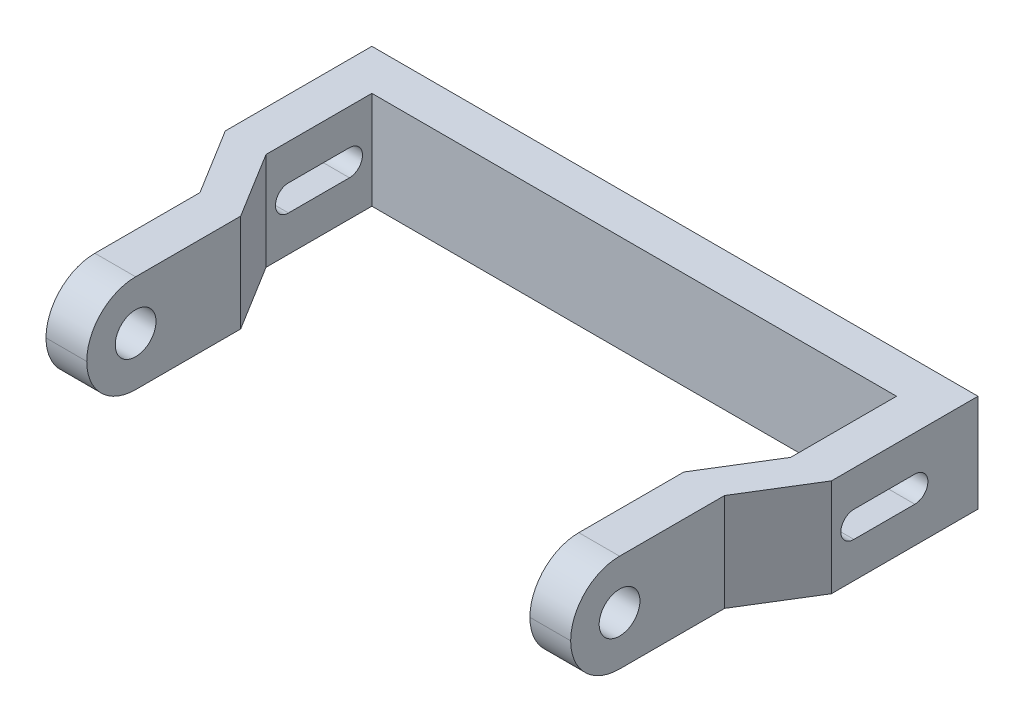
ISO-10303-21;
HEADER;
FILE_DESCRIPTION(('STEP AP214'),'2;1');
FILE_NAME('part.step','',(''),(''),'','','');
FILE_SCHEMA(('AUTOMOTIVE_DESIGN { 1 0 10303 214 1 1 1 1 }'));
ENDSEC;
DATA;
#1=APPLICATION_CONTEXT('core data for automotive mechanical design processes');
#2=APPLICATION_PROTOCOL_DEFINITION('international standard','automotive_design',2000,#1);
#3=PRODUCT_CONTEXT('',#1,'mechanical');
#4=PRODUCT('Part','Part','',(#3));
#5=PRODUCT_RELATED_PRODUCT_CATEGORY('part','',(#4));
#6=PRODUCT_DEFINITION_FORMATION('','',#4);
#7=PRODUCT_DEFINITION_CONTEXT('part definition',#1,'design');
#8=PRODUCT_DEFINITION('design','',#6,#7);
#9=PRODUCT_DEFINITION_SHAPE('','',#8);
#10=(LENGTH_UNIT() NAMED_UNIT(*) SI_UNIT(.MILLI.,.METRE.));
#11=(NAMED_UNIT(*) PLANE_ANGLE_UNIT() SI_UNIT($,.RADIAN.));
#12=(NAMED_UNIT(*) SI_UNIT($,.STERADIAN.) SOLID_ANGLE_UNIT());
#13=UNCERTAINTY_MEASURE_WITH_UNIT(LENGTH_MEASURE(1.E-05),#10,'distance_accuracy_value','');
#14=(GEOMETRIC_REPRESENTATION_CONTEXT(3) GLOBAL_UNCERTAINTY_ASSIGNED_CONTEXT((#13)) GLOBAL_UNIT_ASSIGNED_CONTEXT((#10,
#11,#12)) REPRESENTATION_CONTEXT('',''));
#15=CARTESIAN_POINT('',(0.,0.,0.));
#16=DIRECTION('',(0.,0.,1.));
#17=DIRECTION('',(1.,0.,0.));
#18=AXIS2_PLACEMENT_3D('',#15,#16,#17);
#19=CARTESIAN_POINT('',(-32.2,12.,0.));
#20=DIRECTION('',(1.,0.,0.));
#21=DIRECTION('',(0.,0.,-1.));
#22=AXIS2_PLACEMENT_3D('',#19,#20,#21);
#23=PLANE('',#22);
#24=CARTESIAN_POINT('',(-32.2,6.,-37.2476369583803));
#25=DIRECTION('',(1.,0.,0.));
#26=DIRECTION('',(0.,0.,-1.));
#27=AXIS2_PLACEMENT_3D('',#24,#25,#26);
#28=CIRCLE('',#27,1.6);
#29=CARTESIAN_POINT('',(-32.2,4.4,-37.2476369583803));
#30=VERTEX_POINT('',#29);
#31=CARTESIAN_POINT('',(-32.2,7.6,-37.2476369583803));
#32=VERTEX_POINT('',#31);
#33=EDGE_CURVE('E283',#30,#32,#28,.T.);
#34=ORIENTED_EDGE('',*,*,#33,.F.);
#35=DIRECTION('',(0.,0.,-1.));
#36=VECTOR('',#35,1.);
#37=CARTESIAN_POINT('',(-32.2,4.40000000000001,0.));
#38=LINE('',#37,#36);
#39=CARTESIAN_POINT('',(-32.2,4.4,-29.765898702015));
#40=VERTEX_POINT('',#39);
#41=EDGE_CURVE('E269',#40,#30,#38,.T.);
#42=ORIENTED_EDGE('',*,*,#41,.F.);
#43=CARTESIAN_POINT('',(-32.2,6.,-29.765898702015));
#44=DIRECTION('',(1.,0.,0.));
#45=DIRECTION('',(0.,0.,-1.));
#46=AXIS2_PLACEMENT_3D('',#43,#44,#45);
#47=CIRCLE('',#46,1.6);
#48=CARTESIAN_POINT('',(-32.2,7.6,-29.765898702015));
#49=VERTEX_POINT('',#48);
#50=EDGE_CURVE('E274',#49,#40,#47,.T.);
#51=ORIENTED_EDGE('',*,*,#50,.F.);
#52=DIRECTION('',(0.,0.,1.));
#53=VECTOR('',#52,1.);
#54=CARTESIAN_POINT('',(-32.2,7.60000000000001,0.));
#55=LINE('',#54,#53);
#56=EDGE_CURVE('E280',#32,#49,#55,.T.);
#57=ORIENTED_EDGE('',*,*,#56,.F.);
#58=EDGE_LOOP('',(#34,#42,#51,#57));
#59=FACE_BOUND('',#58,.T.);
#60=DIRECTION('',(0.,0.,1.));
#61=VECTOR('',#60,1.);
#62=CARTESIAN_POINT('',(-32.2,0.,0.));
#63=LINE('',#62,#61);
#64=CARTESIAN_POINT('',(-32.2,0.,-40.));
#65=VERTEX_POINT('',#64);
#66=CARTESIAN_POINT('',(-32.2,0.,-27.0067678301976));
#67=VERTEX_POINT('',#66);
#68=EDGE_CURVE('E295',#65,#67,#63,.T.);
#69=ORIENTED_EDGE('',*,*,#68,.F.);
#70=DIRECTION('',(0.,-1.,0.));
#71=VECTOR('',#70,1.);
#72=CARTESIAN_POINT('',(-32.2,12.,-40.));
#73=LINE('',#72,#71);
#74=CARTESIAN_POINT('',(-32.2,12.,-40.));
#75=VERTEX_POINT('',#74);
#76=EDGE_CURVE('E395',#75,#65,#73,.T.);
#77=ORIENTED_EDGE('',*,*,#76,.F.);
#78=DIRECTION('',(0.,0.,1.));
#79=VECTOR('',#78,1.);
#80=CARTESIAN_POINT('',(-32.2,12.,0.));
#81=LINE('',#80,#79);
#82=CARTESIAN_POINT('',(-32.2,12.,-27.0067678301976));
#83=VERTEX_POINT('',#82);
#84=EDGE_CURVE('E296',#75,#83,#81,.T.);
#85=ORIENTED_EDGE('',*,*,#84,.T.);
#86=DIRECTION('',(0.,-1.,0.));
#87=VECTOR('',#86,1.);
#88=CARTESIAN_POINT('',(-32.2,12.,-27.0067678301976));
#89=LINE('',#88,#87);
#90=EDGE_CURVE('E334',#83,#67,#89,.T.);
#91=ORIENTED_EDGE('',*,*,#90,.T.);
#92=EDGE_LOOP('',(#69,#77,#85,#91));
#93=FACE_BOUND('',#92,.T.);
#94=ADVANCED_FACE('F41',(#59,#93),#23,.T.);
#95=CARTESIAN_POINT('',(0.,12.,-40.));
#96=DIRECTION('',(0.,0.,1.));
#97=DIRECTION('',(1.,0.,0.));
#98=AXIS2_PLACEMENT_3D('',#95,#96,#97);
#99=PLANE('',#98);
#100=DIRECTION('',(-1.,0.,0.));
#101=VECTOR('',#100,1.);
#102=CARTESIAN_POINT('',(0.,0.,-40.));
#103=LINE('',#102,#101);
#104=CARTESIAN_POINT('',(32.2,0.,-40.));
#105=VERTEX_POINT('',#104);
#106=EDGE_CURVE('E337',#105,#65,#103,.T.);
#107=ORIENTED_EDGE('',*,*,#106,.F.);
#108=DIRECTION('',(0.,-1.,0.));
#109=VECTOR('',#108,1.);
#110=CARTESIAN_POINT('',(32.2,12.,-40.));
#111=LINE('',#110,#109);
#112=CARTESIAN_POINT('',(32.2,12.,-40.));
#113=VERTEX_POINT('',#112);
#114=EDGE_CURVE('E393',#113,#105,#111,.T.);
#115=ORIENTED_EDGE('',*,*,#114,.F.);
#116=DIRECTION('',(-1.,0.,0.));
#117=VECTOR('',#116,1.);
#118=CARTESIAN_POINT('',(0.,12.,-40.));
#119=LINE('',#118,#117);
#120=EDGE_CURVE('E299',#113,#75,#119,.T.);
#121=ORIENTED_EDGE('',*,*,#120,.T.);
#122=ORIENTED_EDGE('',*,*,#76,.T.);
#123=EDGE_LOOP('',(#107,#115,#121,#122));
#124=FACE_BOUND('',#123,.T.);
#125=ADVANCED_FACE('F491',(#124),#99,.T.);
#126=CARTESIAN_POINT('',(32.2,12.,0.));
#127=DIRECTION('',(1.,0.,0.));
#128=DIRECTION('',(0.,0.,-1.));
#129=AXIS2_PLACEMENT_3D('',#126,#127,#128);
#130=PLANE('',#129);
#131=DIRECTION('',(0.,0.,-1.));
#132=VECTOR('',#131,1.);
#133=CARTESIAN_POINT('',(32.2,4.40000000000001,0.));
#134=LINE('',#133,#132);
#135=CARTESIAN_POINT('',(32.2,4.4,-29.765898702015));
#136=VERTEX_POINT('',#135);
#137=CARTESIAN_POINT('',(32.2,4.4,-37.2476369583803));
#138=VERTEX_POINT('',#137);
#139=EDGE_CURVE('E261',#136,#138,#134,.T.);
#140=ORIENTED_EDGE('',*,*,#139,.T.);
#141=CARTESIAN_POINT('',(32.2,6.,-37.2476369583803));
#142=DIRECTION('',(1.,0.,0.));
#143=DIRECTION('',(0.,0.,-1.));
#144=AXIS2_PLACEMENT_3D('',#141,#142,#143);
#145=CIRCLE('',#144,1.6);
#146=CARTESIAN_POINT('',(32.2,7.6,-37.2476369583803));
#147=VERTEX_POINT('',#146);
#148=EDGE_CURVE('E223',#138,#147,#145,.T.);
#149=ORIENTED_EDGE('',*,*,#148,.T.);
#150=DIRECTION('',(0.,0.,1.));
#151=VECTOR('',#150,1.);
#152=CARTESIAN_POINT('',(32.2,7.60000000000001,0.));
#153=LINE('',#152,#151);
#154=CARTESIAN_POINT('',(32.2,7.6,-29.765898702015));
#155=VERTEX_POINT('',#154);
#156=EDGE_CURVE('E277',#147,#155,#153,.T.);
#157=ORIENTED_EDGE('',*,*,#156,.T.);
#158=CARTESIAN_POINT('',(32.2,6.,-29.765898702015));
#159=DIRECTION('',(1.,0.,0.));
#160=DIRECTION('',(0.,0.,-1.));
#161=AXIS2_PLACEMENT_3D('',#158,#159,#160);
#162=CIRCLE('',#161,1.6);
#163=EDGE_CURVE('E271',#155,#136,#162,.T.);
#164=ORIENTED_EDGE('',*,*,#163,.T.);
#165=EDGE_LOOP('',(#140,#149,#157,#164));
#166=FACE_BOUND('',#165,.T.);
#167=DIRECTION('',(0.,0.,1.));
#168=VECTOR('',#167,1.);
#169=CARTESIAN_POINT('',(32.2,0.,0.));
#170=LINE('',#169,#168);
#171=CARTESIAN_POINT('',(32.2,0.,-27.0067678301976));
#172=VERTEX_POINT('',#171);
#173=EDGE_CURVE('E340',#105,#172,#170,.T.);
#174=ORIENTED_EDGE('',*,*,#173,.T.);
#175=DIRECTION('',(0.,-1.,0.));
#176=VECTOR('',#175,1.);
#177=CARTESIAN_POINT('',(32.2,12.,-27.0067678301976));
#178=LINE('',#177,#176);
#179=CARTESIAN_POINT('',(32.2,12.,-27.0067678301976));
#180=VERTEX_POINT('',#179);
#181=EDGE_CURVE('E390',#180,#172,#178,.T.);
#182=ORIENTED_EDGE('',*,*,#181,.F.);
#183=DIRECTION('',(0.,0.,1.));
#184=VECTOR('',#183,1.);
#185=CARTESIAN_POINT('',(32.2,12.,0.));
#186=LINE('',#185,#184);
#187=EDGE_CURVE('E303',#113,#180,#186,.T.);
#188=ORIENTED_EDGE('',*,*,#187,.F.);
#189=ORIENTED_EDGE('',*,*,#114,.T.);
#190=EDGE_LOOP('',(#174,#182,#188,#189));
#191=FACE_BOUND('',#190,.T.);
#192=ADVANCED_FACE('F494',(#166,#191),#130,.F.);
#193=CARTESIAN_POINT('',(11.2701558565888,12.,6.94714132776244));
#194=DIRECTION('',(0.851264943092478,0.,0.524736120980593));
#195=DIRECTION('',(0.524736120980593,0.,-0.851264943092478));
#196=AXIS2_PLACEMENT_3D('',#193,#194,#195);
#197=PLANE('',#196);
#198=DIRECTION('',(-0.524736120980593,0.,0.851264943092478));
#199=VECTOR('',#198,1.);
#200=CARTESIAN_POINT('',(11.2701558565888,0.,6.94714132776244));
#201=LINE('',#200,#199);
#202=CARTESIAN_POINT('',(27.2,0.,-18.8954056706641));
#203=VERTEX_POINT('',#202);
#204=EDGE_CURVE('E342',#172,#203,#201,.T.);
#205=ORIENTED_EDGE('',*,*,#204,.T.);
#206=DIRECTION('',(0.,-1.,0.));
#207=VECTOR('',#206,1.);
#208=CARTESIAN_POINT('',(27.2,12.,-18.8954056706641));
#209=LINE('',#208,#207);
#210=CARTESIAN_POINT('',(27.2,12.,-18.8954056706641));
#211=VERTEX_POINT('',#210);
#212=EDGE_CURVE('E387',#211,#203,#209,.T.);
#213=ORIENTED_EDGE('',*,*,#212,.F.);
#214=DIRECTION('',(-0.524736120980593,0.,0.851264943092478));
#215=VECTOR('',#214,1.);
#216=CARTESIAN_POINT('',(11.2701558565888,12.,6.94714132776244));
#217=LINE('',#216,#215);
#218=EDGE_CURVE('E305',#180,#211,#217,.T.);
#219=ORIENTED_EDGE('',*,*,#218,.F.);
#220=ORIENTED_EDGE('',*,*,#181,.T.);
#221=EDGE_LOOP('',(#205,#213,#219,#220));
#222=FACE_BOUND('',#221,.T.);
#223=ADVANCED_FACE('F442',(#222),#197,.F.);
#224=CARTESIAN_POINT('',(27.2,12.,0.));
#225=DIRECTION('',(1.,0.,0.));
#226=DIRECTION('',(0.,0.,-1.));
#227=AXIS2_PLACEMENT_3D('',#224,#225,#226);
#228=PLANE('',#227);
#229=CARTESIAN_POINT('',(27.2,6.,-5.99999999999998));
#230=DIRECTION('',(1.,0.,0.));
#231=DIRECTION('',(0.,0.,-1.));
#232=AXIS2_PLACEMENT_3D('',#229,#230,#231);
#233=CIRCLE('',#232,2.5);
#234=CARTESIAN_POINT('',(27.2,6.,-8.49999999999998));
#235=VERTEX_POINT('',#234);
#236=EDGE_CURVE('E292',#235,#235,#233,.T.);
#237=ORIENTED_EDGE('',*,*,#236,.T.);
#238=EDGE_LOOP('',(#237));
#239=FACE_BOUND('',#238,.T.);
#240=DIRECTION('',(0.,0.,1.));
#241=VECTOR('',#240,1.);
#242=CARTESIAN_POINT('',(27.2,0.,0.));
#243=LINE('',#242,#241);
#244=CARTESIAN_POINT('',(27.2,0.,-6.));
#245=VERTEX_POINT('',#244);
#246=EDGE_CURVE('E344',#203,#245,#243,.T.);
#247=ORIENTED_EDGE('',*,*,#246,.T.);
#248=CARTESIAN_POINT('',(27.2,6.,-6.));
#249=DIRECTION('',(1.,0.,0.));
#250=DIRECTION('',(0.,0.,-1.));
#251=AXIS2_PLACEMENT_3D('',#248,#249,#250);
#252=CIRCLE('',#251,6.);
#253=CARTESIAN_POINT('',(27.2,6.,0.));
#254=VERTEX_POINT('',#253);
#255=EDGE_CURVE('E11',#245,#254,#252,.F.);
#256=ORIENTED_EDGE('',*,*,#255,.T.);
#257=CARTESIAN_POINT('',(27.2,6.,-6.));
#258=DIRECTION('',(1.,0.,0.));
#259=DIRECTION('',(0.,0.,-1.));
#260=AXIS2_PLACEMENT_3D('',#257,#258,#259);
#261=CIRCLE('',#260,6.);
#262=CARTESIAN_POINT('',(27.2,12.,-6.));
#263=VERTEX_POINT('',#262);
#264=EDGE_CURVE('E50',#254,#263,#261,.F.);
#265=ORIENTED_EDGE('',*,*,#264,.T.);
#266=DIRECTION('',(0.,0.,1.));
#267=VECTOR('',#266,1.);
#268=CARTESIAN_POINT('',(27.2,12.,0.));
#269=LINE('',#268,#267);
#270=EDGE_CURVE('E307',#211,#263,#269,.T.);
#271=ORIENTED_EDGE('',*,*,#270,.F.);
#272=ORIENTED_EDGE('',*,*,#212,.T.);
#273=EDGE_LOOP('',(#247,#256,#265,#271,#272));
#274=FACE_BOUND('',#273,.T.);
#275=ADVANCED_FACE('F432',(#239,#274),#228,.F.);
#276=CARTESIAN_POINT('',(32.2,12.,0.));
#277=DIRECTION('',(1.,0.,0.));
#278=DIRECTION('',(0.,0.,-1.));
#279=AXIS2_PLACEMENT_3D('',#276,#277,#278);
#280=PLANE('',#279);
#281=CARTESIAN_POINT('',(32.2,6.,-5.99999999999997));
#282=DIRECTION('',(1.,0.,0.));
#283=DIRECTION('',(0.,0.,-1.));
#284=AXIS2_PLACEMENT_3D('',#281,#282,#283);
#285=CIRCLE('',#284,2.5);
#286=CARTESIAN_POINT('',(32.2,6.,-8.49999999999997));
#287=VERTEX_POINT('',#286);
#288=EDGE_CURVE('E289',#287,#287,#285,.T.);
#289=ORIENTED_EDGE('',*,*,#288,.F.);
#290=EDGE_LOOP('',(#289));
#291=FACE_BOUND('',#290,.T.);
#292=CARTESIAN_POINT('',(32.2,6.,-6.));
#293=DIRECTION('',(1.,0.,0.));
#294=DIRECTION('',(0.,0.,-1.));
#295=AXIS2_PLACEMENT_3D('',#292,#293,#294);
#296=CIRCLE('',#295,6.);
#297=CARTESIAN_POINT('',(32.2,12.,-6.));
#298=VERTEX_POINT('',#297);
#299=CARTESIAN_POINT('',(32.2,6.,0.));
#300=VERTEX_POINT('',#299);
#301=EDGE_CURVE('E64',#298,#300,#296,.T.);
#302=ORIENTED_EDGE('',*,*,#301,.T.);
#303=CARTESIAN_POINT('',(32.2,6.,-6.));
#304=DIRECTION('',(1.,0.,0.));
#305=DIRECTION('',(0.,0.,-1.));
#306=AXIS2_PLACEMENT_3D('',#303,#304,#305);
#307=CIRCLE('',#306,6.);
#308=CARTESIAN_POINT('',(32.2,0.,-6.));
#309=VERTEX_POINT('',#308);
#310=EDGE_CURVE('E418',#300,#309,#307,.T.);
#311=ORIENTED_EDGE('',*,*,#310,.T.);
#312=DIRECTION('',(0.,0.,1.));
#313=VECTOR('',#312,1.);
#314=CARTESIAN_POINT('',(32.2,0.,0.));
#315=LINE('',#314,#313);
#316=CARTESIAN_POINT('',(32.2,0.,-18.8954056706641));
#317=VERTEX_POINT('',#316);
#318=EDGE_CURVE('E346',#317,#309,#315,.T.);
#319=ORIENTED_EDGE('',*,*,#318,.F.);
#320=DIRECTION('',(0.,-1.,0.));
#321=VECTOR('',#320,1.);
#322=CARTESIAN_POINT('',(32.2,12.,-18.8954056706641));
#323=LINE('',#322,#321);
#324=CARTESIAN_POINT('',(32.2,12.,-18.8954056706641));
#325=VERTEX_POINT('',#324);
#326=EDGE_CURVE('E385',#325,#317,#323,.T.);
#327=ORIENTED_EDGE('',*,*,#326,.F.);
#328=DIRECTION('',(0.,0.,1.));
#329=VECTOR('',#328,1.);
#330=CARTESIAN_POINT('',(32.2,12.,0.));
#331=LINE('',#330,#329);
#332=EDGE_CURVE('E310',#325,#298,#331,.T.);
#333=ORIENTED_EDGE('',*,*,#332,.T.);
#334=EDGE_LOOP('',(#302,#311,#319,#327,#333));
#335=FACE_BOUND('',#334,.T.);
#336=ADVANCED_FACE('F450',(#291,#335),#280,.T.);
#337=CARTESIAN_POINT('',(14.89341587328,12.,9.180588648588));
#338=DIRECTION('',(0.851264943092478,0.,0.524736120980593));
#339=DIRECTION('',(0.524736120980593,0.,-0.851264943092478));
#340=AXIS2_PLACEMENT_3D('',#337,#338,#339);
#341=PLANE('',#340);
#342=DIRECTION('',(-0.524736120980593,0.,0.851264943092478));
#343=VECTOR('',#342,1.);
#344=CARTESIAN_POINT('',(14.89341587328,0.,9.180588648588));
#345=LINE('',#344,#343);
#346=CARTESIAN_POINT('',(37.2,0.,-27.0067678301976));
#347=VERTEX_POINT('',#346);
#348=EDGE_CURVE('E349',#347,#317,#345,.T.);
#349=ORIENTED_EDGE('',*,*,#348,.F.);
#350=DIRECTION('',(0.,-1.,0.));
#351=VECTOR('',#350,1.);
#352=CARTESIAN_POINT('',(37.2,12.,-27.0067678301976));
#353=LINE('',#352,#351);
#354=CARTESIAN_POINT('',(37.2,12.,-27.0067678301976));
#355=VERTEX_POINT('',#354);
#356=EDGE_CURVE('E383',#355,#347,#353,.T.);
#357=ORIENTED_EDGE('',*,*,#356,.F.);
#358=DIRECTION('',(-0.524736120980593,0.,0.851264943092478));
#359=VECTOR('',#358,1.);
#360=CARTESIAN_POINT('',(14.89341587328,12.,9.180588648588));
#361=LINE('',#360,#359);
#362=EDGE_CURVE('E312',#355,#325,#361,.T.);
#363=ORIENTED_EDGE('',*,*,#362,.T.);
#364=ORIENTED_EDGE('',*,*,#326,.T.);
#365=EDGE_LOOP('',(#349,#357,#363,#364));
#366=FACE_BOUND('',#365,.T.);
#367=ADVANCED_FACE('F454',(#366),#341,.T.);
#368=CARTESIAN_POINT('',(37.2,12.,0.));
#369=DIRECTION('',(1.,0.,0.));
#370=DIRECTION('',(0.,0.,-1.));
#371=AXIS2_PLACEMENT_3D('',#368,#369,#370);
#372=PLANE('',#371);
#373=CARTESIAN_POINT('',(37.2,6.,-37.2476369583803));
#374=DIRECTION('',(-1.,0.,0.));
#375=DIRECTION('',(0.,0.,1.));
#376=AXIS2_PLACEMENT_3D('',#373,#374,#375);
#377=CIRCLE('',#376,1.6);
#378=CARTESIAN_POINT('',(37.2,7.6,-37.2476369583803));
#379=VERTEX_POINT('',#378);
#380=CARTESIAN_POINT('',(37.2,4.4,-37.2476369583803));
#381=VERTEX_POINT('',#380);
#382=EDGE_CURVE('E220',#379,#381,#377,.T.);
#383=ORIENTED_EDGE('',*,*,#382,.T.);
#384=DIRECTION('',(0.,0.,1.));
#385=VECTOR('',#384,1.);
#386=CARTESIAN_POINT('',(37.2,4.4,-37.2476369583803));
#387=LINE('',#386,#385);
#388=CARTESIAN_POINT('',(37.2,4.4,-29.765898702015));
#389=VERTEX_POINT('',#388);
#390=EDGE_CURVE('E231',#381,#389,#387,.T.);
#391=ORIENTED_EDGE('',*,*,#390,.T.);
#392=CARTESIAN_POINT('',(37.2,6.,-29.765898702015));
#393=DIRECTION('',(-1.,0.,0.));
#394=DIRECTION('',(0.,0.,1.));
#395=AXIS2_PLACEMENT_3D('',#392,#393,#394);
#396=CIRCLE('',#395,1.6);
#397=CARTESIAN_POINT('',(37.2,7.6,-29.765898702015));
#398=VERTEX_POINT('',#397);
#399=EDGE_CURVE('E237',#389,#398,#396,.T.);
#400=ORIENTED_EDGE('',*,*,#399,.T.);
#401=DIRECTION('',(0.,0.,-1.));
#402=VECTOR('',#401,1.);
#403=CARTESIAN_POINT('',(37.2,7.6,-37.2476369583803));
#404=LINE('',#403,#402);
#405=EDGE_CURVE('E242',#398,#379,#404,.T.);
#406=ORIENTED_EDGE('',*,*,#405,.T.);
#407=EDGE_LOOP('',(#383,#391,#400,#406));
#408=FACE_BOUND('',#407,.T.);
#409=DIRECTION('',(0.,0.,1.));
#410=VECTOR('',#409,1.);
#411=CARTESIAN_POINT('',(37.2,0.,0.));
#412=LINE('',#411,#410);
#413=CARTESIAN_POINT('',(37.2,0.,-45.));
#414=VERTEX_POINT('',#413);
#415=EDGE_CURVE('E352',#414,#347,#412,.T.);
#416=ORIENTED_EDGE('',*,*,#415,.F.);
#417=DIRECTION('',(0.,-1.,0.));
#418=VECTOR('',#417,1.);
#419=CARTESIAN_POINT('',(37.2,12.,-45.));
#420=LINE('',#419,#418);
#421=CARTESIAN_POINT('',(37.2,12.,-45.));
#422=VERTEX_POINT('',#421);
#423=EDGE_CURVE('E381',#422,#414,#420,.T.);
#424=ORIENTED_EDGE('',*,*,#423,.F.);
#425=DIRECTION('',(0.,0.,1.));
#426=VECTOR('',#425,1.);
#427=CARTESIAN_POINT('',(37.2,12.,0.));
#428=LINE('',#427,#426);
#429=EDGE_CURVE('E315',#422,#355,#428,.T.);
#430=ORIENTED_EDGE('',*,*,#429,.T.);
#431=ORIENTED_EDGE('',*,*,#356,.T.);
#432=EDGE_LOOP('',(#416,#424,#430,#431));
#433=FACE_BOUND('',#432,.T.);
#434=ADVANCED_FACE('F239',(#408,#433),#372,.T.);
#435=CARTESIAN_POINT('',(0.,12.,-45.));
#436=DIRECTION('',(0.,0.,-1.));
#437=DIRECTION('',(-1.,0.,0.));
#438=AXIS2_PLACEMENT_3D('',#435,#436,#437);
#439=PLANE('',#438);
#440=DIRECTION('',(1.,0.,0.));
#441=VECTOR('',#440,1.);
#442=CARTESIAN_POINT('',(0.,0.,-45.));
#443=LINE('',#442,#441);
#444=CARTESIAN_POINT('',(-37.2,0.,-45.));
#445=VERTEX_POINT('',#444);
#446=EDGE_CURVE('E355',#445,#414,#443,.T.);
#447=ORIENTED_EDGE('',*,*,#446,.F.);
#448=DIRECTION('',(0.,-1.,0.));
#449=VECTOR('',#448,1.);
#450=CARTESIAN_POINT('',(-37.2,12.,-45.));
#451=LINE('',#450,#449);
#452=CARTESIAN_POINT('',(-37.2,12.,-45.));
#453=VERTEX_POINT('',#452);
#454=EDGE_CURVE('E379',#453,#445,#451,.T.);
#455=ORIENTED_EDGE('',*,*,#454,.F.);
#456=DIRECTION('',(1.,0.,0.));
#457=VECTOR('',#456,1.);
#458=CARTESIAN_POINT('',(0.,12.,-45.));
#459=LINE('',#458,#457);
#460=EDGE_CURVE('E318',#453,#422,#459,.T.);
#461=ORIENTED_EDGE('',*,*,#460,.T.);
#462=ORIENTED_EDGE('',*,*,#423,.T.);
#463=EDGE_LOOP('',(#447,#455,#461,#462));
#464=FACE_BOUND('',#463,.T.);
#465=ADVANCED_FACE('F459',(#464),#439,.T.);
#466=CARTESIAN_POINT('',(-37.2,12.,0.));
#467=DIRECTION('',(1.,0.,0.));
#468=DIRECTION('',(0.,0.,-1.));
#469=AXIS2_PLACEMENT_3D('',#466,#467,#468);
#470=PLANE('',#469);
#471=DIRECTION('',(0.,0.,1.));
#472=VECTOR('',#471,1.);
#473=CARTESIAN_POINT('',(-37.2,4.4,-37.2476369583803));
#474=LINE('',#473,#472);
#475=CARTESIAN_POINT('',(-37.2,4.4,-37.2476369583803));
#476=VERTEX_POINT('',#475);
#477=CARTESIAN_POINT('',(-37.2,4.4,-29.765898702015));
#478=VERTEX_POINT('',#477);
#479=EDGE_CURVE('E253',#476,#478,#474,.T.);
#480=ORIENTED_EDGE('',*,*,#479,.F.);
#481=CARTESIAN_POINT('',(-37.2,6.,-37.2476369583803));
#482=DIRECTION('',(-1.,0.,0.));
#483=DIRECTION('',(0.,0.,1.));
#484=AXIS2_PLACEMENT_3D('',#481,#482,#483);
#485=CIRCLE('',#484,1.6);
#486=CARTESIAN_POINT('',(-37.2,7.6,-37.2476369583803));
#487=VERTEX_POINT('',#486);
#488=EDGE_CURVE('E251',#487,#476,#485,.T.);
#489=ORIENTED_EDGE('',*,*,#488,.F.);
#490=DIRECTION('',(0.,0.,-1.));
#491=VECTOR('',#490,1.);
#492=CARTESIAN_POINT('',(-37.2,7.6,-37.2476369583803));
#493=LINE('',#492,#491);
#494=CARTESIAN_POINT('',(-37.2,7.6,-29.765898702015));
#495=VERTEX_POINT('',#494);
#496=EDGE_CURVE('E243',#495,#487,#493,.T.);
#497=ORIENTED_EDGE('',*,*,#496,.F.);
#498=CARTESIAN_POINT('',(-37.2,6.,-29.765898702015));
#499=DIRECTION('',(-1.,0.,0.));
#500=DIRECTION('',(0.,0.,1.));
#501=AXIS2_PLACEMENT_3D('',#498,#499,#500);
#502=CIRCLE('',#501,1.6);
#503=EDGE_CURVE('E246',#478,#495,#502,.T.);
#504=ORIENTED_EDGE('',*,*,#503,.F.);
#505=EDGE_LOOP('',(#480,#489,#497,#504));
#506=FACE_BOUND('',#505,.T.);
#507=DIRECTION('',(0.,0.,1.));
#508=VECTOR('',#507,1.);
#509=CARTESIAN_POINT('',(-37.2,0.,0.));
#510=LINE('',#509,#508);
#511=CARTESIAN_POINT('',(-37.2,0.,-27.0067678301976));
#512=VERTEX_POINT('',#511);
#513=EDGE_CURVE('E358',#445,#512,#510,.T.);
#514=ORIENTED_EDGE('',*,*,#513,.T.);
#515=DIRECTION('',(0.,-1.,0.));
#516=VECTOR('',#515,1.);
#517=CARTESIAN_POINT('',(-37.2,12.,-27.0067678301976));
#518=LINE('',#517,#516);
#519=CARTESIAN_POINT('',(-37.2,12.,-27.0067678301976));
#520=VERTEX_POINT('',#519);
#521=EDGE_CURVE('E376',#520,#512,#518,.T.);
#522=ORIENTED_EDGE('',*,*,#521,.F.);
#523=DIRECTION('',(0.,0.,1.));
#524=VECTOR('',#523,1.);
#525=CARTESIAN_POINT('',(-37.2,12.,0.));
#526=LINE('',#525,#524);
#527=EDGE_CURVE('E321',#453,#520,#526,.T.);
#528=ORIENTED_EDGE('',*,*,#527,.F.);
#529=ORIENTED_EDGE('',*,*,#454,.T.);
#530=EDGE_LOOP('',(#514,#522,#528,#529));
#531=FACE_BOUND('',#530,.T.);
#532=ADVANCED_FACE('F464',(#506,#531),#470,.F.);
#533=CARTESIAN_POINT('',(-14.89341587328,12.,9.180588648588));
#534=DIRECTION('',(0.851264943092478,0.,-0.524736120980593));
#535=DIRECTION('',(-0.524736120980593,0.,-0.851264943092478));
#536=AXIS2_PLACEMENT_3D('',#533,#534,#535);
#537=PLANE('',#536);
#538=DIRECTION('',(0.524736120980593,0.,0.851264943092478));
#539=VECTOR('',#538,1.);
#540=CARTESIAN_POINT('',(-14.89341587328,0.,9.180588648588));
#541=LINE('',#540,#539);
#542=CARTESIAN_POINT('',(-32.2,0.,-18.8954056706641));
#543=VERTEX_POINT('',#542);
#544=EDGE_CURVE('E360',#512,#543,#541,.T.);
#545=ORIENTED_EDGE('',*,*,#544,.T.);
#546=DIRECTION('',(0.,-1.,0.));
#547=VECTOR('',#546,1.);
#548=CARTESIAN_POINT('',(-32.2,12.,-18.8954056706641));
#549=LINE('',#548,#547);
#550=CARTESIAN_POINT('',(-32.2,12.,-18.8954056706641));
#551=VERTEX_POINT('',#550);
#552=EDGE_CURVE('E373',#551,#543,#549,.T.);
#553=ORIENTED_EDGE('',*,*,#552,.F.);
#554=DIRECTION('',(0.524736120980593,0.,0.851264943092478));
#555=VECTOR('',#554,1.);
#556=CARTESIAN_POINT('',(-14.89341587328,12.,9.180588648588));
#557=LINE('',#556,#555);
#558=EDGE_CURVE('E323',#520,#551,#557,.T.);
#559=ORIENTED_EDGE('',*,*,#558,.F.);
#560=ORIENTED_EDGE('',*,*,#521,.T.);
#561=EDGE_LOOP('',(#545,#553,#559,#560));
#562=FACE_BOUND('',#561,.T.);
#563=ADVANCED_FACE('F470',(#562),#537,.F.);
#564=CARTESIAN_POINT('',(-32.2,12.,0.));
#565=DIRECTION('',(1.,0.,0.));
#566=DIRECTION('',(0.,0.,-1.));
#567=AXIS2_PLACEMENT_3D('',#564,#565,#566);
#568=PLANE('',#567);
#569=CARTESIAN_POINT('',(-32.2,6.,-6.00000000000003));
#570=DIRECTION('',(-1.,0.,0.));
#571=DIRECTION('',(0.,0.,1.));
#572=AXIS2_PLACEMENT_3D('',#569,#570,#571);
#573=CIRCLE('',#572,2.5);
#574=CARTESIAN_POINT('',(-32.2,6.,-3.50000000000003));
#575=VERTEX_POINT('',#574);
#576=EDGE_CURVE('E285',#575,#575,#573,.T.);
#577=ORIENTED_EDGE('',*,*,#576,.F.);
#578=EDGE_LOOP('',(#577));
#579=FACE_BOUND('',#578,.T.);
#580=DIRECTION('',(0.,0.,1.));
#581=VECTOR('',#580,1.);
#582=CARTESIAN_POINT('',(-32.2,0.,0.));
#583=LINE('',#582,#581);
#584=CARTESIAN_POINT('',(-32.2,0.,-6.));
#585=VERTEX_POINT('',#584);
#586=EDGE_CURVE('E362',#543,#585,#583,.T.);
#587=ORIENTED_EDGE('',*,*,#586,.T.);
#588=CARTESIAN_POINT('',(-32.2,6.,-6.));
#589=DIRECTION('',(1.,0.,0.));
#590=DIRECTION('',(0.,0.,-1.));
#591=AXIS2_PLACEMENT_3D('',#588,#589,#590);
#592=CIRCLE('',#591,6.);
#593=CARTESIAN_POINT('',(-32.2,6.,0.));
#594=VERTEX_POINT('',#593);
#595=EDGE_CURVE('E407',#585,#594,#592,.F.);
#596=ORIENTED_EDGE('',*,*,#595,.T.);
#597=CARTESIAN_POINT('',(-32.2,6.,-6.));
#598=DIRECTION('',(1.,0.,0.));
#599=DIRECTION('',(0.,0.,-1.));
#600=AXIS2_PLACEMENT_3D('',#597,#598,#599);
#601=CIRCLE('',#600,6.);
#602=CARTESIAN_POINT('',(-32.2,12.,-6.));
#603=VERTEX_POINT('',#602);
#604=EDGE_CURVE('E405',#594,#603,#601,.F.);
#605=ORIENTED_EDGE('',*,*,#604,.T.);
#606=DIRECTION('',(0.,0.,1.));
#607=VECTOR('',#606,1.);
#608=CARTESIAN_POINT('',(-32.2,12.,0.));
#609=LINE('',#608,#607);
#610=EDGE_CURVE('E325',#551,#603,#609,.T.);
#611=ORIENTED_EDGE('',*,*,#610,.F.);
#612=ORIENTED_EDGE('',*,*,#552,.T.);
#613=EDGE_LOOP('',(#587,#596,#605,#611,#612));
#614=FACE_BOUND('',#613,.T.);
#615=ADVANCED_FACE('F474',(#579,#614),#568,.F.);
#616=CARTESIAN_POINT('',(-27.2,12.,0.));
#617=DIRECTION('',(1.,0.,0.));
#618=DIRECTION('',(0.,0.,-1.));
#619=AXIS2_PLACEMENT_3D('',#616,#617,#618);
#620=PLANE('',#619);
#621=CARTESIAN_POINT('',(-27.2,6.,-6.00000000000002));
#622=DIRECTION('',(1.,0.,0.));
#623=DIRECTION('',(0.,0.,-1.));
#624=AXIS2_PLACEMENT_3D('',#621,#622,#623);
#625=CIRCLE('',#624,2.5);
#626=CARTESIAN_POINT('',(-27.2,6.,-8.50000000000002));
#627=VERTEX_POINT('',#626);
#628=EDGE_CURVE('E288',#627,#627,#625,.T.);
#629=ORIENTED_EDGE('',*,*,#628,.F.);
#630=EDGE_LOOP('',(#629));
#631=FACE_BOUND('',#630,.T.);
#632=CARTESIAN_POINT('',(-27.2,6.,-6.));
#633=DIRECTION('',(1.,0.,0.));
#634=DIRECTION('',(0.,0.,-1.));
#635=AXIS2_PLACEMENT_3D('',#632,#633,#634);
#636=CIRCLE('',#635,6.);
#637=CARTESIAN_POINT('',(-27.2,12.,-6.));
#638=VERTEX_POINT('',#637);
#639=CARTESIAN_POINT('',(-27.2,6.,0.));
#640=VERTEX_POINT('',#639);
#641=EDGE_CURVE('E409',#638,#640,#636,.T.);
#642=ORIENTED_EDGE('',*,*,#641,.T.);
#643=CARTESIAN_POINT('',(-27.2,6.,-6.));
#644=DIRECTION('',(1.,0.,0.));
#645=DIRECTION('',(0.,0.,-1.));
#646=AXIS2_PLACEMENT_3D('',#643,#644,#645);
#647=CIRCLE('',#646,6.);
#648=CARTESIAN_POINT('',(-27.2,0.,-6.));
#649=VERTEX_POINT('',#648);
#650=EDGE_CURVE('E411',#640,#649,#647,.T.);
#651=ORIENTED_EDGE('',*,*,#650,.T.);
#652=DIRECTION('',(0.,0.,1.));
#653=VECTOR('',#652,1.);
#654=CARTESIAN_POINT('',(-27.2,0.,0.));
#655=LINE('',#654,#653);
#656=CARTESIAN_POINT('',(-27.2,0.,-18.8954056706641));
#657=VERTEX_POINT('',#656);
#658=EDGE_CURVE('E365',#657,#649,#655,.T.);
#659=ORIENTED_EDGE('',*,*,#658,.F.);
#660=DIRECTION('',(0.,-1.,0.));
#661=VECTOR('',#660,1.);
#662=CARTESIAN_POINT('',(-27.2,12.,-18.8954056706641));
#663=LINE('',#662,#661);
#664=CARTESIAN_POINT('',(-27.2,12.,-18.8954056706641));
#665=VERTEX_POINT('',#664);
#666=EDGE_CURVE('E371',#665,#657,#663,.T.);
#667=ORIENTED_EDGE('',*,*,#666,.F.);
#668=DIRECTION('',(0.,0.,1.));
#669=VECTOR('',#668,1.);
#670=CARTESIAN_POINT('',(-27.2,12.,0.));
#671=LINE('',#670,#669);
#672=EDGE_CURVE('E328',#665,#638,#671,.T.);
#673=ORIENTED_EDGE('',*,*,#672,.T.);
#674=EDGE_LOOP('',(#642,#651,#659,#667,#673));
#675=FACE_BOUND('',#674,.T.);
#676=ADVANCED_FACE('F482',(#631,#675),#620,.T.);
#677=CARTESIAN_POINT('',(-11.2701558565888,12.,6.94714132776244));
#678=DIRECTION('',(0.851264943092478,0.,-0.524736120980593));
#679=DIRECTION('',(-0.524736120980593,0.,-0.851264943092478));
#680=AXIS2_PLACEMENT_3D('',#677,#678,#679);
#681=PLANE('',#680);
#682=DIRECTION('',(0.524736120980593,0.,0.851264943092478));
#683=VECTOR('',#682,1.);
#684=CARTESIAN_POINT('',(-11.2701558565888,0.,6.94714132776244));
#685=LINE('',#684,#683);
#686=EDGE_CURVE('E300',#67,#657,#685,.T.);
#687=ORIENTED_EDGE('',*,*,#686,.F.);
#688=ORIENTED_EDGE('',*,*,#90,.F.);
#689=DIRECTION('',(0.524736120980593,0.,0.851264943092478));
#690=VECTOR('',#689,1.);
#691=CARTESIAN_POINT('',(-11.2701558565888,12.,6.94714132776244));
#692=LINE('',#691,#690);
#693=EDGE_CURVE('E331',#83,#665,#692,.T.);
#694=ORIENTED_EDGE('',*,*,#693,.T.);
#695=ORIENTED_EDGE('',*,*,#666,.T.);
#696=EDGE_LOOP('',(#687,#688,#694,#695));
#697=FACE_BOUND('',#696,.T.);
#698=ADVANCED_FACE('F486',(#697),#681,.T.);
#699=CARTESIAN_POINT('',(0.,12.,0.));
#700=DIRECTION('',(0.,1.,0.));
#701=DIRECTION('',(0.,0.,1.));
#702=AXIS2_PLACEMENT_3D('',#699,#700,#701);
#703=PLANE('',#702);
#704=ORIENTED_EDGE('',*,*,#610,.T.);
#705=DIRECTION('',(-1.,0.,0.));
#706=VECTOR('',#705,1.);
#707=CARTESIAN_POINT('',(0.,12.,-6.));
#708=LINE('',#707,#706);
#709=EDGE_CURVE('E415',#603,#638,#708,.F.);
#710=ORIENTED_EDGE('',*,*,#709,.T.);
#711=ORIENTED_EDGE('',*,*,#672,.F.);
#712=ORIENTED_EDGE('',*,*,#693,.F.);
#713=ORIENTED_EDGE('',*,*,#84,.F.);
#714=ORIENTED_EDGE('',*,*,#120,.F.);
#715=ORIENTED_EDGE('',*,*,#187,.T.);
#716=ORIENTED_EDGE('',*,*,#218,.T.);
#717=ORIENTED_EDGE('',*,*,#270,.T.);
#718=DIRECTION('',(1.,0.,0.));
#719=VECTOR('',#718,1.);
#720=CARTESIAN_POINT('',(32.2,12.,-6.));
#721=LINE('',#720,#719);
#722=EDGE_CURVE('E413',#263,#298,#721,.T.);
#723=ORIENTED_EDGE('',*,*,#722,.T.);
#724=ORIENTED_EDGE('',*,*,#332,.F.);
#725=ORIENTED_EDGE('',*,*,#362,.F.);
#726=ORIENTED_EDGE('',*,*,#429,.F.);
#727=ORIENTED_EDGE('',*,*,#460,.F.);
#728=ORIENTED_EDGE('',*,*,#527,.T.);
#729=ORIENTED_EDGE('',*,*,#558,.T.);
#730=EDGE_LOOP('',(#704,#710,#711,#712,#713,#714,#715,#716,#717,#723,#724,#725,#726,#727,#728,#729));
#731=FACE_BOUND('',#730,.T.);
#732=ADVANCED_FACE('F434',(#731),#703,.T.);
#733=CARTESIAN_POINT('',(0.,0.,0.));
#734=DIRECTION('',(0.,1.,0.));
#735=DIRECTION('',(0.,0.,1.));
#736=AXIS2_PLACEMENT_3D('',#733,#734,#735);
#737=PLANE('',#736);
#738=ORIENTED_EDGE('',*,*,#658,.T.);
#739=DIRECTION('',(-1.,0.,0.));
#740=VECTOR('',#739,1.);
#741=CARTESIAN_POINT('',(-32.2,0.,-6.));
#742=LINE('',#741,#740);
#743=EDGE_CURVE('E402',#649,#585,#742,.T.);
#744=ORIENTED_EDGE('',*,*,#743,.T.);
#745=ORIENTED_EDGE('',*,*,#586,.F.);
#746=ORIENTED_EDGE('',*,*,#544,.F.);
#747=ORIENTED_EDGE('',*,*,#513,.F.);
#748=ORIENTED_EDGE('',*,*,#446,.T.);
#749=ORIENTED_EDGE('',*,*,#415,.T.);
#750=ORIENTED_EDGE('',*,*,#348,.T.);
#751=ORIENTED_EDGE('',*,*,#318,.T.);
#752=DIRECTION('',(1.,0.,0.));
#753=VECTOR('',#752,1.);
#754=CARTESIAN_POINT('',(0.,0.,-6.));
#755=LINE('',#754,#753);
#756=EDGE_CURVE('E397',#309,#245,#755,.F.);
#757=ORIENTED_EDGE('',*,*,#756,.T.);
#758=ORIENTED_EDGE('',*,*,#246,.F.);
#759=ORIENTED_EDGE('',*,*,#204,.F.);
#760=ORIENTED_EDGE('',*,*,#173,.F.);
#761=ORIENTED_EDGE('',*,*,#106,.T.);
#762=ORIENTED_EDGE('',*,*,#68,.T.);
#763=ORIENTED_EDGE('',*,*,#686,.T.);
#764=EDGE_LOOP('',(#738,#744,#745,#746,#747,#748,#749,#750,#751,#757,#758,#759,#760,#761,#762,#763));
#765=FACE_BOUND('',#764,.T.);
#766=ADVANCED_FACE('F446',(#765),#737,.F.);
#767=CARTESIAN_POINT('',(37.2,6.,-5.99999999999997));
#768=DIRECTION('',(-1.,0.,0.));
#769=DIRECTION('',(0.,0.,1.));
#770=AXIS2_PLACEMENT_3D('',#767,#768,#769);
#771=CYLINDRICAL_SURFACE('',#770,2.5);
#772=ORIENTED_EDGE('',*,*,#628,.T.);
#773=EDGE_LOOP('',(#772));
#774=FACE_BOUND('',#773,.T.);
#775=ORIENTED_EDGE('',*,*,#576,.T.);
#776=EDGE_LOOP('',(#775));
#777=FACE_BOUND('',#776,.T.);
#778=ADVANCED_FACE('F535',(#774,#777),#771,.F.);
#779=ORIENTED_EDGE('',*,*,#288,.T.);
#780=EDGE_LOOP('',(#779));
#781=FACE_BOUND('',#780,.T.);
#782=ORIENTED_EDGE('',*,*,#236,.F.);
#783=EDGE_LOOP('',(#782));
#784=FACE_BOUND('',#783,.T.);
#785=ADVANCED_FACE('F642',(#781,#784),#771,.F.);
#786=CARTESIAN_POINT('',(37.2,4.4,-37.2476369583803));
#787=DIRECTION('',(0.,-1.,0.));
#788=DIRECTION('',(0.,0.,-1.));
#789=AXIS2_PLACEMENT_3D('',#786,#787,#788);
#790=PLANE('',#789);
#791=ORIENTED_EDGE('',*,*,#41,.T.);
#792=DIRECTION('',(-1.,0.,0.));
#793=VECTOR('',#792,1.);
#794=CARTESIAN_POINT('',(37.2,4.4,-37.2476369583803));
#795=LINE('',#794,#793);
#796=EDGE_CURVE('E227',#30,#476,#795,.T.);
#797=ORIENTED_EDGE('',*,*,#796,.T.);
#798=ORIENTED_EDGE('',*,*,#479,.T.);
#799=DIRECTION('',(-1.,0.,0.));
#800=VECTOR('',#799,1.);
#801=CARTESIAN_POINT('',(37.2,4.4,-29.765898702015));
#802=LINE('',#801,#800);
#803=EDGE_CURVE('E226',#40,#478,#802,.T.);
#804=ORIENTED_EDGE('',*,*,#803,.F.);
#805=EDGE_LOOP('',(#791,#797,#798,#804));
#806=FACE_BOUND('',#805,.T.);
#807=ADVANCED_FACE('F587',(#806),#790,.F.);
#808=CARTESIAN_POINT('',(37.2,6.,-29.765898702015));
#809=DIRECTION('',(-1.,0.,0.));
#810=DIRECTION('',(0.,0.,1.));
#811=AXIS2_PLACEMENT_3D('',#808,#809,#810);
#812=CYLINDRICAL_SURFACE('',#811,1.6);
#813=ORIENTED_EDGE('',*,*,#50,.T.);
#814=ORIENTED_EDGE('',*,*,#803,.T.);
#815=ORIENTED_EDGE('',*,*,#503,.T.);
#816=DIRECTION('',(-1.,0.,0.));
#817=VECTOR('',#816,1.);
#818=CARTESIAN_POINT('',(37.2,7.6,-29.765898702015));
#819=LINE('',#818,#817);
#820=EDGE_CURVE('E266',#49,#495,#819,.T.);
#821=ORIENTED_EDGE('',*,*,#820,.F.);
#822=EDGE_LOOP('',(#813,#814,#815,#821));
#823=FACE_BOUND('',#822,.T.);
#824=ADVANCED_FACE('F597',(#823),#812,.F.);
#825=CARTESIAN_POINT('',(37.2,7.6,-37.2476369583803));
#826=DIRECTION('',(0.,1.,0.));
#827=DIRECTION('',(0.,0.,1.));
#828=AXIS2_PLACEMENT_3D('',#825,#826,#827);
#829=PLANE('',#828);
#830=ORIENTED_EDGE('',*,*,#56,.T.);
#831=ORIENTED_EDGE('',*,*,#820,.T.);
#832=ORIENTED_EDGE('',*,*,#496,.T.);
#833=DIRECTION('',(-1.,0.,0.));
#834=VECTOR('',#833,1.);
#835=CARTESIAN_POINT('',(37.2,7.6,-37.2476369583803));
#836=LINE('',#835,#834);
#837=EDGE_CURVE('E262',#32,#487,#836,.T.);
#838=ORIENTED_EDGE('',*,*,#837,.F.);
#839=EDGE_LOOP('',(#830,#831,#832,#838));
#840=FACE_BOUND('',#839,.T.);
#841=ADVANCED_FACE('F606',(#840),#829,.F.);
#842=CARTESIAN_POINT('',(37.2,6.,-37.2476369583803));
#843=DIRECTION('',(-1.,0.,0.));
#844=DIRECTION('',(0.,0.,1.));
#845=AXIS2_PLACEMENT_3D('',#842,#843,#844);
#846=CYLINDRICAL_SURFACE('',#845,1.6);
#847=ORIENTED_EDGE('',*,*,#33,.T.);
#848=ORIENTED_EDGE('',*,*,#837,.T.);
#849=ORIENTED_EDGE('',*,*,#488,.T.);
#850=ORIENTED_EDGE('',*,*,#796,.F.);
#851=EDGE_LOOP('',(#847,#848,#849,#850));
#852=FACE_BOUND('',#851,.T.);
#853=ADVANCED_FACE('F613',(#852),#846,.F.);
#854=EDGE_CURVE('E215',#381,#138,#795,.T.);
#855=ORIENTED_EDGE('',*,*,#854,.F.);
#856=ORIENTED_EDGE('',*,*,#382,.F.);
#857=EDGE_CURVE('E259',#379,#147,#836,.T.);
#858=ORIENTED_EDGE('',*,*,#857,.T.);
#859=ORIENTED_EDGE('',*,*,#148,.F.);
#860=EDGE_LOOP('',(#855,#856,#858,#859));
#861=FACE_BOUND('',#860,.T.);
#862=ADVANCED_FACE('F217',(#861),#846,.F.);
#863=ORIENTED_EDGE('',*,*,#857,.F.);
#864=ORIENTED_EDGE('',*,*,#405,.F.);
#865=EDGE_CURVE('E263',#398,#155,#819,.T.);
#866=ORIENTED_EDGE('',*,*,#865,.T.);
#867=ORIENTED_EDGE('',*,*,#156,.F.);
#868=EDGE_LOOP('',(#863,#864,#866,#867));
#869=FACE_BOUND('',#868,.T.);
#870=ADVANCED_FACE('F594',(#869),#829,.F.);
#871=ORIENTED_EDGE('',*,*,#865,.F.);
#872=ORIENTED_EDGE('',*,*,#399,.F.);
#873=EDGE_CURVE('E234',#389,#136,#802,.T.);
#874=ORIENTED_EDGE('',*,*,#873,.T.);
#875=ORIENTED_EDGE('',*,*,#163,.F.);
#876=EDGE_LOOP('',(#871,#872,#874,#875));
#877=FACE_BOUND('',#876,.T.);
#878=ADVANCED_FACE('F585',(#877),#812,.F.);
#879=ORIENTED_EDGE('',*,*,#873,.F.);
#880=ORIENTED_EDGE('',*,*,#390,.F.);
#881=ORIENTED_EDGE('',*,*,#854,.T.);
#882=ORIENTED_EDGE('',*,*,#139,.F.);
#883=EDGE_LOOP('',(#879,#880,#881,#882));
#884=FACE_BOUND('',#883,.T.);
#885=ADVANCED_FACE('F232',(#884),#790,.F.);
#886=CARTESIAN_POINT('',(0.,6.,-6.));
#887=DIRECTION('',(-1.,0.,0.));
#888=DIRECTION('',(0.,0.,1.));
#889=AXIS2_PLACEMENT_3D('',#886,#887,#888);
#890=CYLINDRICAL_SURFACE('',#889,6.);
#891=DIRECTION('',(-1.,0.,0.));
#892=VECTOR('',#891,1.);
#893=CARTESIAN_POINT('',(0.,6.,0.));
#894=LINE('',#893,#892);
#895=EDGE_CURVE('E254',#640,#594,#894,.T.);
#896=ORIENTED_EDGE('',*,*,#895,.F.);
#897=ORIENTED_EDGE('',*,*,#641,.F.);
#898=ORIENTED_EDGE('',*,*,#709,.F.);
#899=ORIENTED_EDGE('',*,*,#604,.F.);
#900=EDGE_LOOP('',(#896,#897,#898,#899));
#901=FACE_BOUND('',#900,.T.);
#902=ADVANCED_FACE('F477',(#901),#890,.T.);
#903=CARTESIAN_POINT('',(0.,6.,-6.));
#904=DIRECTION('',(1.,0.,0.));
#905=DIRECTION('',(0.,0.,-1.));
#906=AXIS2_PLACEMENT_3D('',#903,#904,#905);
#907=CYLINDRICAL_SURFACE('',#906,6.);
#908=ORIENTED_EDGE('',*,*,#650,.F.);
#909=ORIENTED_EDGE('',*,*,#895,.T.);
#910=ORIENTED_EDGE('',*,*,#595,.F.);
#911=ORIENTED_EDGE('',*,*,#743,.F.);
#912=EDGE_LOOP('',(#908,#909,#910,#911));
#913=FACE_BOUND('',#912,.T.);
#914=ADVANCED_FACE('F507',(#913),#907,.T.);
#915=CARTESIAN_POINT('',(0.,6.,-6.));
#916=DIRECTION('',(-1.,0.,0.));
#917=DIRECTION('',(0.,0.,1.));
#918=AXIS2_PLACEMENT_3D('',#915,#916,#917);
#919=CYLINDRICAL_SURFACE('',#918,6.);
#920=ORIENTED_EDGE('',*,*,#722,.F.);
#921=ORIENTED_EDGE('',*,*,#264,.F.);
#922=DIRECTION('',(1.,0.,0.));
#923=VECTOR('',#922,1.);
#924=CARTESIAN_POINT('',(27.2,6.,0.));
#925=LINE('',#924,#923);
#926=EDGE_CURVE('E45',#300,#254,#925,.F.);
#927=ORIENTED_EDGE('',*,*,#926,.F.);
#928=ORIENTED_EDGE('',*,*,#301,.F.);
#929=EDGE_LOOP('',(#920,#921,#927,#928));
#930=FACE_BOUND('',#929,.T.);
#931=ADVANCED_FACE('F43',(#930),#919,.T.);
#932=CARTESIAN_POINT('',(0.,6.,-6.));
#933=DIRECTION('',(1.,0.,0.));
#934=DIRECTION('',(0.,0.,-1.));
#935=AXIS2_PLACEMENT_3D('',#932,#933,#934);
#936=CYLINDRICAL_SURFACE('',#935,6.);
#937=ORIENTED_EDGE('',*,*,#255,.F.);
#938=ORIENTED_EDGE('',*,*,#756,.F.);
#939=ORIENTED_EDGE('',*,*,#310,.F.);
#940=ORIENTED_EDGE('',*,*,#926,.T.);
#941=EDGE_LOOP('',(#937,#938,#939,#940));
#942=FACE_BOUND('',#941,.T.);
#943=ADVANCED_FACE('F427',(#942),#936,.T.);
#944=CLOSED_SHELL('',(#94,#125,#192,#223,#275,#336,#367,#434,#465,#532,#563,#615,#676,#698,#732,
#766,#778,#785,#807,#824,#841,#853,#862,#870,#878,#885,#902,#914,#931,#943));
#945=MANIFOLD_SOLID_BREP('B2',#944);
#946=ADVANCED_BREP_SHAPE_REPRESENTATION('',(#18,#945),#14);
#947=SHAPE_DEFINITION_REPRESENTATION(#9,#946);
ENDSEC;
END-ISO-10303-21;
